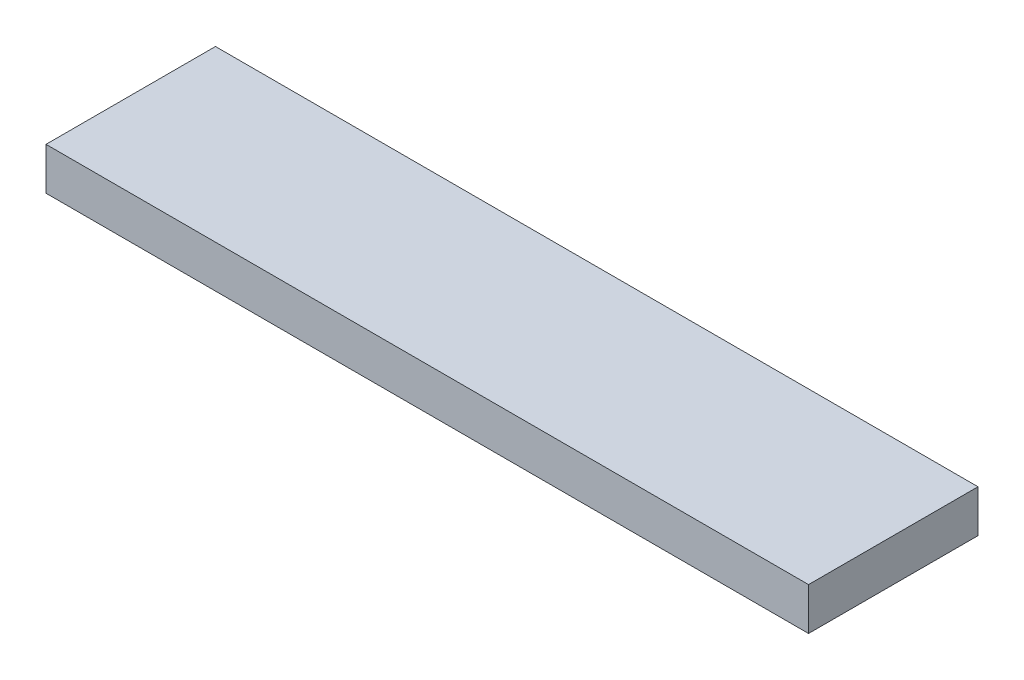
ISO-10303-21;
HEADER;
FILE_DESCRIPTION(('STEP AP214'),'2;1');
FILE_NAME('part.step','',(''),(''),'','','');
FILE_SCHEMA(('AUTOMOTIVE_DESIGN { 1 0 10303 214 1 1 1 1 }'));
ENDSEC;
DATA;
#1=APPLICATION_CONTEXT('core data for automotive mechanical design processes');
#2=APPLICATION_PROTOCOL_DEFINITION('international standard','automotive_design',2000,#1);
#3=PRODUCT_CONTEXT('',#1,'mechanical');
#4=PRODUCT('Part','Part','',(#3));
#5=PRODUCT_RELATED_PRODUCT_CATEGORY('part','',(#4));
#6=PRODUCT_DEFINITION_FORMATION('','',#4);
#7=PRODUCT_DEFINITION_CONTEXT('part definition',#1,'design');
#8=PRODUCT_DEFINITION('design','',#6,#7);
#9=PRODUCT_DEFINITION_SHAPE('','',#8);
#10=(LENGTH_UNIT() NAMED_UNIT(*) SI_UNIT(.MILLI.,.METRE.));
#11=(NAMED_UNIT(*) PLANE_ANGLE_UNIT() SI_UNIT($,.RADIAN.));
#12=(NAMED_UNIT(*) SI_UNIT($,.STERADIAN.) SOLID_ANGLE_UNIT());
#13=UNCERTAINTY_MEASURE_WITH_UNIT(LENGTH_MEASURE(1.E-05),#10,'distance_accuracy_value','');
#14=(GEOMETRIC_REPRESENTATION_CONTEXT(3) GLOBAL_UNCERTAINTY_ASSIGNED_CONTEXT((#13)) GLOBAL_UNIT_ASSIGNED_CONTEXT((#10,
#11,#12)) REPRESENTATION_CONTEXT('',''));
#15=CARTESIAN_POINT('',(0.,0.,0.));
#16=DIRECTION('',(0.,0.,1.));
#17=DIRECTION('',(1.,0.,0.));
#18=AXIS2_PLACEMENT_3D('',#15,#16,#17);
#19=CARTESIAN_POINT('',(0.,1.,0.));
#20=DIRECTION('',(1.,0.,0.));
#21=DIRECTION('',(0.,0.,-1.));
#22=AXIS2_PLACEMENT_3D('',#19,#20,#21);
#23=PLANE('',#22);
#24=DIRECTION('',(0.,0.,1.));
#25=VECTOR('',#24,1.);
#26=CARTESIAN_POINT('',(0.,0.,0.));
#27=LINE('',#26,#25);
#28=CARTESIAN_POINT('',(0.,0.,-4.));
#29=VERTEX_POINT('',#28);
#30=CARTESIAN_POINT('',(0.,0.,0.));
#31=VERTEX_POINT('',#30);
#32=EDGE_CURVE('E99',#29,#31,#27,.T.);
#33=ORIENTED_EDGE('',*,*,#32,.T.);
#34=DIRECTION('',(0.,-1.,0.));
#35=VECTOR('',#34,1.);
#36=CARTESIAN_POINT('',(0.,1.,0.));
#37=LINE('',#36,#35);
#38=CARTESIAN_POINT('',(0.,1.,0.));
#39=VERTEX_POINT('',#38);
#40=EDGE_CURVE('E11',#39,#31,#37,.T.);
#41=ORIENTED_EDGE('',*,*,#40,.F.);
#42=DIRECTION('',(0.,0.,1.));
#43=VECTOR('',#42,1.);
#44=CARTESIAN_POINT('',(0.,1.,0.));
#45=LINE('',#44,#43);
#46=CARTESIAN_POINT('',(0.,1.,-4.));
#47=VERTEX_POINT('',#46);
#48=EDGE_CURVE('E87',#47,#39,#45,.T.);
#49=ORIENTED_EDGE('',*,*,#48,.F.);
#50=DIRECTION('',(0.,-1.,0.));
#51=VECTOR('',#50,1.);
#52=CARTESIAN_POINT('',(0.,1.,-4.));
#53=LINE('',#52,#51);
#54=EDGE_CURVE('E95',#47,#29,#53,.T.);
#55=ORIENTED_EDGE('',*,*,#54,.T.);
#56=EDGE_LOOP('',(#33,#41,#49,#55));
#57=FACE_BOUND('',#56,.T.);
#58=ADVANCED_FACE('F36',(#57),#23,.F.);
#59=CARTESIAN_POINT('',(0.,1.,0.));
#60=DIRECTION('',(0.,0.,-1.));
#61=DIRECTION('',(-1.,0.,0.));
#62=AXIS2_PLACEMENT_3D('',#59,#60,#61);
#63=PLANE('',#62);
#64=DIRECTION('',(1.,0.,0.));
#65=VECTOR('',#64,1.);
#66=CARTESIAN_POINT('',(0.,0.,0.));
#67=LINE('',#66,#65);
#68=CARTESIAN_POINT('',(18.,0.,0.));
#69=VERTEX_POINT('',#68);
#70=EDGE_CURVE('E91',#31,#69,#67,.T.);
#71=ORIENTED_EDGE('',*,*,#70,.T.);
#72=DIRECTION('',(0.,-1.,0.));
#73=VECTOR('',#72,1.);
#74=CARTESIAN_POINT('',(18.,1.,0.));
#75=LINE('',#74,#73);
#76=CARTESIAN_POINT('',(18.,1.,0.));
#77=VERTEX_POINT('',#76);
#78=EDGE_CURVE('E44',#77,#69,#75,.T.);
#79=ORIENTED_EDGE('',*,*,#78,.F.);
#80=DIRECTION('',(1.,0.,0.));
#81=VECTOR('',#80,1.);
#82=CARTESIAN_POINT('',(0.,1.,0.));
#83=LINE('',#82,#81);
#84=EDGE_CURVE('E82',#39,#77,#83,.T.);
#85=ORIENTED_EDGE('',*,*,#84,.F.);
#86=ORIENTED_EDGE('',*,*,#40,.T.);
#87=EDGE_LOOP('',(#71,#79,#85,#86));
#88=FACE_BOUND('',#87,.T.);
#89=ADVANCED_FACE('F90',(#88),#63,.F.);
#90=CARTESIAN_POINT('',(18.,1.,0.));
#91=DIRECTION('',(-1.,0.,0.));
#92=DIRECTION('',(0.,0.,1.));
#93=AXIS2_PLACEMENT_3D('',#90,#91,#92);
#94=PLANE('',#93);
#95=DIRECTION('',(0.,0.,-1.));
#96=VECTOR('',#95,1.);
#97=CARTESIAN_POINT('',(18.,0.,0.));
#98=LINE('',#97,#96);
#99=CARTESIAN_POINT('',(18.,0.,-4.));
#100=VERTEX_POINT('',#99);
#101=EDGE_CURVE('E69',#69,#100,#98,.T.);
#102=ORIENTED_EDGE('',*,*,#101,.T.);
#103=DIRECTION('',(0.,-1.,0.));
#104=VECTOR('',#103,1.);
#105=CARTESIAN_POINT('',(18.,1.,-4.));
#106=LINE('',#105,#104);
#107=CARTESIAN_POINT('',(18.,1.,-4.));
#108=VERTEX_POINT('',#107);
#109=EDGE_CURVE('E92',#108,#100,#106,.T.);
#110=ORIENTED_EDGE('',*,*,#109,.F.);
#111=DIRECTION('',(0.,0.,-1.));
#112=VECTOR('',#111,1.);
#113=CARTESIAN_POINT('',(18.,1.,0.));
#114=LINE('',#113,#112);
#115=EDGE_CURVE('E85',#77,#108,#114,.T.);
#116=ORIENTED_EDGE('',*,*,#115,.F.);
#117=ORIENTED_EDGE('',*,*,#78,.T.);
#118=EDGE_LOOP('',(#102,#110,#116,#117));
#119=FACE_BOUND('',#118,.T.);
#120=ADVANCED_FACE('F93',(#119),#94,.F.);
#121=CARTESIAN_POINT('',(0.,1.,-4.));
#122=DIRECTION('',(0.,0.,1.));
#123=DIRECTION('',(1.,0.,0.));
#124=AXIS2_PLACEMENT_3D('',#121,#122,#123);
#125=PLANE('',#124);
#126=DIRECTION('',(-1.,0.,0.));
#127=VECTOR('',#126,1.);
#128=CARTESIAN_POINT('',(0.,0.,-4.));
#129=LINE('',#128,#127);
#130=EDGE_CURVE('E75',#100,#29,#129,.T.);
#131=ORIENTED_EDGE('',*,*,#130,.T.);
#132=ORIENTED_EDGE('',*,*,#54,.F.);
#133=DIRECTION('',(-1.,0.,0.));
#134=VECTOR('',#133,1.);
#135=CARTESIAN_POINT('',(0.,1.,-4.));
#136=LINE('',#135,#134);
#137=EDGE_CURVE('E52',#108,#47,#136,.T.);
#138=ORIENTED_EDGE('',*,*,#137,.F.);
#139=ORIENTED_EDGE('',*,*,#109,.T.);
#140=EDGE_LOOP('',(#131,#132,#138,#139));
#141=FACE_BOUND('',#140,.T.);
#142=ADVANCED_FACE('F106',(#141),#125,.F.);
#143=CARTESIAN_POINT('',(0.,1.,0.));
#144=DIRECTION('',(0.,-1.,0.));
#145=DIRECTION('',(0.,0.,-1.));
#146=AXIS2_PLACEMENT_3D('',#143,#144,#145);
#147=PLANE('',#146);
#148=ORIENTED_EDGE('',*,*,#48,.T.);
#149=ORIENTED_EDGE('',*,*,#84,.T.);
#150=ORIENTED_EDGE('',*,*,#115,.T.);
#151=ORIENTED_EDGE('',*,*,#137,.T.);
#152=EDGE_LOOP('',(#148,#149,#150,#151));
#153=FACE_BOUND('',#152,.T.);
#154=ADVANCED_FACE('F83',(#153),#147,.F.);
#155=CARTESIAN_POINT('',(0.,0.,0.));
#156=DIRECTION('',(0.,-1.,0.));
#157=DIRECTION('',(0.,0.,-1.));
#158=AXIS2_PLACEMENT_3D('',#155,#156,#157);
#159=PLANE('',#158);
#160=ORIENTED_EDGE('',*,*,#32,.F.);
#161=ORIENTED_EDGE('',*,*,#130,.F.);
#162=ORIENTED_EDGE('',*,*,#101,.F.);
#163=ORIENTED_EDGE('',*,*,#70,.F.);
#164=EDGE_LOOP('',(#160,#161,#162,#163));
#165=FACE_BOUND('',#164,.T.);
#166=ADVANCED_FACE('F109',(#165),#159,.T.);
#167=CLOSED_SHELL('',(#58,#89,#120,#142,#154,#166));
#168=MANIFOLD_SOLID_BREP('B2',#167);
#169=ADVANCED_BREP_SHAPE_REPRESENTATION('',(#18,#168),#14);
#170=SHAPE_DEFINITION_REPRESENTATION(#9,#169);
ENDSEC;
END-ISO-10303-21;
